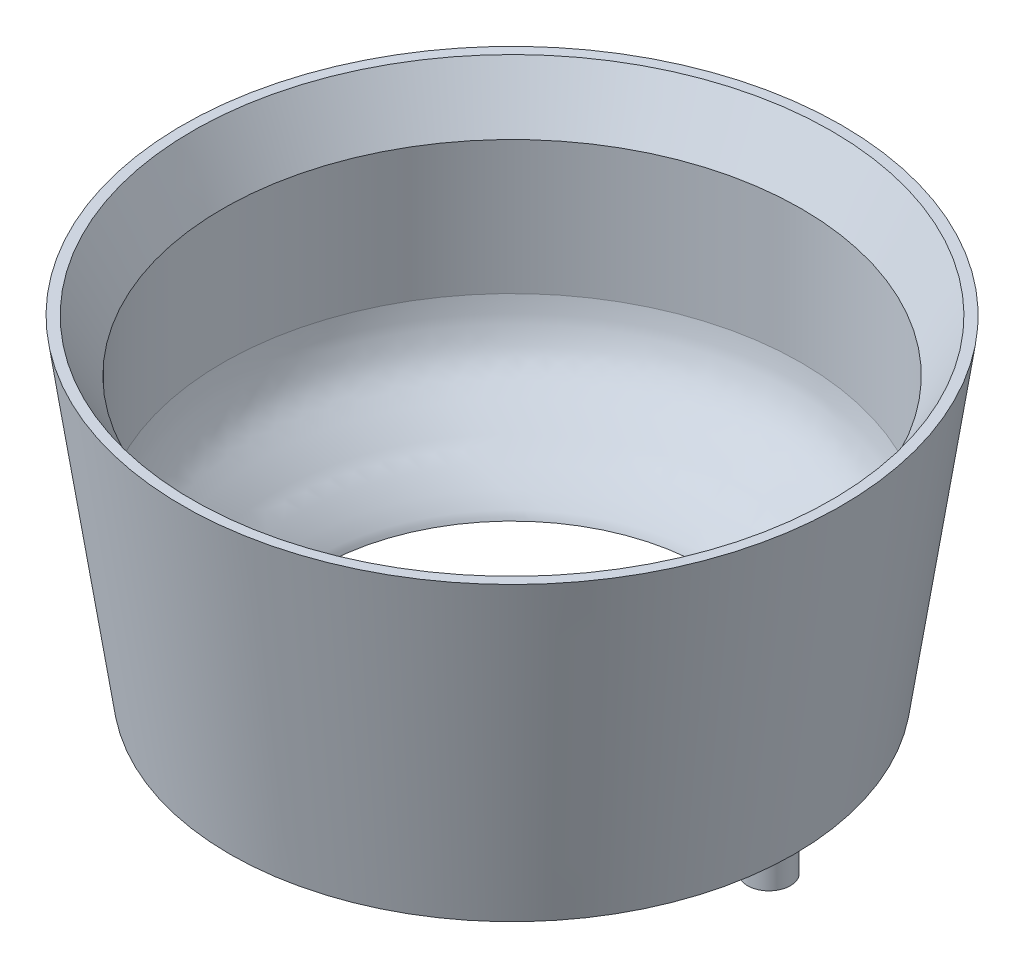
ISO-10303-21;
HEADER;
FILE_DESCRIPTION(('STEP AP214'),'2;1');
FILE_NAME('part.step','',(''),(''),'','','');
FILE_SCHEMA(('AUTOMOTIVE_DESIGN { 1 0 10303 214 1 1 1 1 }'));
ENDSEC;
DATA;
#1=APPLICATION_CONTEXT('core data for automotive mechanical design processes');
#2=APPLICATION_PROTOCOL_DEFINITION('international standard','automotive_design',2000,#1);
#3=PRODUCT_CONTEXT('',#1,'mechanical');
#4=PRODUCT('Part','Part','',(#3));
#5=PRODUCT_RELATED_PRODUCT_CATEGORY('part','',(#4));
#6=PRODUCT_DEFINITION_FORMATION('','',#4);
#7=PRODUCT_DEFINITION_CONTEXT('part definition',#1,'design');
#8=PRODUCT_DEFINITION('design','',#6,#7);
#9=PRODUCT_DEFINITION_SHAPE('','',#8);
#10=(LENGTH_UNIT() NAMED_UNIT(*) SI_UNIT(.MILLI.,.METRE.));
#11=(NAMED_UNIT(*) PLANE_ANGLE_UNIT() SI_UNIT($,.RADIAN.));
#12=(NAMED_UNIT(*) SI_UNIT($,.STERADIAN.) SOLID_ANGLE_UNIT());
#13=UNCERTAINTY_MEASURE_WITH_UNIT(LENGTH_MEASURE(1.E-05),#10,'distance_accuracy_value','');
#14=(GEOMETRIC_REPRESENTATION_CONTEXT(3) GLOBAL_UNCERTAINTY_ASSIGNED_CONTEXT((#13)) GLOBAL_UNIT_ASSIGNED_CONTEXT((#10,
#11,#12)) REPRESENTATION_CONTEXT('',''));
#15=CARTESIAN_POINT('',(0.,0.,0.));
#16=DIRECTION('',(0.,0.,1.));
#17=DIRECTION('',(1.,0.,0.));
#18=AXIS2_PLACEMENT_3D('',#15,#16,#17);
#19=CARTESIAN_POINT('',(0.,295.540718437762,-40.5476747547934));
#20=CARTESIAN_POINT('',(0.,295.012709615636,-40.4477404657415));
#21=CARTESIAN_POINT('',(0.,293.970757618623,-40.2927773525862));
#22=CARTESIAN_POINT('',(0.,292.587532752845,-39.930889754875));
#23=CARTESIAN_POINT('',(0.,291.581451359409,-39.51618641559));
#24=CARTESIAN_POINT('',(0.,290.578047280025,-39.1083707824325));
#25=CARTESIAN_POINT('',(0.,289.316986818185,-38.4396980542591));
#26=CARTESIAN_POINT('',(0.,288.032583078736,-37.3314160861705));
#27=CARTESIAN_POINT('',(0.,287.115418473763,-36.3683638812662));
#28=CARTESIAN_POINT('',(0.,286.340079672536,-35.6302312643945));
#29=CARTESIAN_POINT('',(0.,285.762737125999,-35.0164727262729));
#30=CARTESIAN_POINT('',(0.,285.247169223289,-34.3942597952709));
#31=CARTESIAN_POINT('',(0.,284.556557999368,-33.6355246615368));
#32=CARTESIAN_POINT('',(0.,283.771384037677,-32.9203613336381));
#33=CARTESIAN_POINT('',(0.,282.986073935963,-32.12965190107));
#34=CARTESIAN_POINT('',(0.,282.459482322822,-31.4852417836461));
#35=CARTESIAN_POINT('',(0.,281.963476572773,-30.9149972084707));
#36=CARTESIAN_POINT('',(0.,281.391298158875,-30.3717003462487));
#37=CARTESIAN_POINT('',(0.,280.804626849955,-29.7827961587849));
#38=CARTESIAN_POINT('',(0.,280.262154528045,-29.2275845813112));
#39=CARTESIAN_POINT('',(0.,279.674853681479,-28.7247526180959));
#40=CARTESIAN_POINT('',(0.,279.039651715273,-28.1803862534295));
#41=CARTESIAN_POINT('',(0.,278.470209991792,-27.651838315325));
#42=CARTESIAN_POINT('',(0.,277.876839186641,-27.3081459354535));
#43=CARTESIAN_POINT('',(0.,277.127164256162,-26.9952300805427));
#44=CARTESIAN_POINT('',(0.,276.164510632259,-26.5979526177344));
#45=CARTESIAN_POINT('',(0.,275.470548140668,-26.4648115829165));
#46=CARTESIAN_POINT('',(0.,274.996982716808,-26.5077562004189));
#47=B_SPLINE_CURVE_WITH_KNOTS('',3,(#19,#20,#21,#22,#23,#24,#25,#26,#27,#28,#29,#30,#31,#32,#33,
#34,#35,#36,#37,#38,#39,#40,#41,#42,#43,#44,#45,#46),.UNSPECIFIED.,.F.,.F.,(4,1,1,1,1,1,1,1,1,1,
1,1,1,1,1,1,1,1,1,1,1,1,1,1,1,4),(0.,0.0625440482121128,0.125088096424226,0.156360120530282,
0.187632144636338,0.250176192848451,0.312720241060564,0.375264289272677,0.406536313378733,
0.43780833748479,0.469080361590846,0.500352385696902,0.562896433909015,0.594168458015071,
0.625440482121128,0.656712506227184,0.687984530333241,0.719256554439297,0.750528578545353,
0.78180060265141,0.813072626757466,0.844344650863523,0.875616674969579,0.906888699075636,
0.938160723181692,1.0007047713938),.UNSPECIFIED.);
#48=CARTESIAN_POINT('',(0.,5.,0.));
#49=DIRECTION('',(0.,-1.,0.));
#50=AXIS1_PLACEMENT('',#48,#49);
#51=SURFACE_OF_REVOLUTION('',#47,#50);
#52=CARTESIAN_POINT('',(0.,277.427423014677,8.72575696706631E-13));
#53=DIRECTION('',(0.,-1.,0.));
#54=DIRECTION('',(0.,0.,-1.));
#55=AXIS2_PLACEMENT_3D('',#52,#53,#54);
#56=CIRCLE('',#55,27.1217156432865);
#57=CARTESIAN_POINT('',(0.,277.427423014677,-27.1217156432856));
#58=VERTEX_POINT('',#57);
#59=EDGE_CURVE('E64',#58,#58,#56,.F.);
#60=ORIENTED_EDGE('',*,*,#59,.F.);
#61=EDGE_LOOP('',(#60));
#62=FACE_BOUND('',#61,.T.);
#63=CARTESIAN_POINT('',(0.,295.540718437762,9.30591960996588E-13));
#64=DIRECTION('',(0.,-1.,0.));
#65=DIRECTION('',(0.,0.,-1.));
#66=AXIS2_PLACEMENT_3D('',#63,#64,#65);
#67=CIRCLE('',#66,40.5476747547944);
#68=CARTESIAN_POINT('',(0.,295.540718437762,-40.5476747547934));
#69=VERTEX_POINT('',#68);
#70=EDGE_CURVE('E53',#69,#69,#67,.T.);
#71=ORIENTED_EDGE('',*,*,#70,.F.);
#72=EDGE_LOOP('',(#71));
#73=FACE_BOUND('',#72,.T.);
#74=ADVANCED_FACE('F33',(#62,#73),#51,.F.);
#75=CARTESIAN_POINT('',(0.,5.,0.));
#76=DIRECTION('',(0.,-1.,0.));
#77=DIRECTION('',(0.,0.,-1.));
#78=AXIS2_PLACEMENT_3D('',#75,#76,#77);
#79=CYLINDRICAL_SURFACE('',#78,40.5476747547944);
#80=ORIENTED_EDGE('',*,*,#70,.T.);
#81=EDGE_LOOP('',(#80));
#82=FACE_BOUND('',#81,.T.);
#83=CARTESIAN_POINT('',(0.,314.238618936809,9.90480695303734E-13));
#84=DIRECTION('',(0.,-1.,0.));
#85=DIRECTION('',(0.,0.,-1.));
#86=AXIS2_PLACEMENT_3D('',#83,#84,#85);
#87=CIRCLE('',#86,40.5476747547944);
#88=CARTESIAN_POINT('',(0.,314.238618936809,-40.5476747547934));
#89=VERTEX_POINT('',#88);
#90=EDGE_CURVE('E68',#89,#89,#87,.T.);
#91=ORIENTED_EDGE('',*,*,#90,.F.);
#92=EDGE_LOOP('',(#91));
#93=FACE_BOUND('',#92,.T.);
#94=ADVANCED_FACE('F88',(#82,#93),#79,.F.);
#95=CARTESIAN_POINT('',(0.,321.561079724369,1.01393428618166E-12));
#96=DIRECTION('',(0.,1.,0.));
#97=DIRECTION('',(0.,0.,1.));
#98=AXIS2_PLACEMENT_3D('',#95,#96,#97);
#99=CONICAL_SURFACE('',#98,44.775299461623,0.523598775598309);
#100=ORIENTED_EDGE('',*,*,#90,.T.);
#101=EDGE_LOOP('',(#100));
#102=FACE_BOUND('',#101,.T.);
#103=CARTESIAN_POINT('',(0.,321.561079724369,1.01393428618166E-12));
#104=DIRECTION('',(0.,-1.,0.));
#105=DIRECTION('',(0.,0.,-1.));
#106=AXIS2_PLACEMENT_3D('',#103,#104,#105);
#107=CIRCLE('',#106,44.775299461623);
#108=CARTESIAN_POINT('',(0.,321.561079724369,-44.775299461622));
#109=VERTEX_POINT('',#108);
#110=EDGE_CURVE('E71',#109,#109,#107,.T.);
#111=ORIENTED_EDGE('',*,*,#110,.F.);
#112=EDGE_LOOP('',(#111));
#113=FACE_BOUND('',#112,.T.);
#114=ADVANCED_FACE('F172',(#102,#113),#99,.F.);
#115=CARTESIAN_POINT('',(0.,321.561079724369,-44.775299461622));
#116=DIRECTION('',(0.,1.,0.));
#117=DIRECTION('',(0.,0.,1.));
#118=AXIS2_PLACEMENT_3D('',#115,#116,#117);
#119=PLANE('',#118);
#120=ORIENTED_EDGE('',*,*,#110,.T.);
#121=EDGE_LOOP('',(#120));
#122=FACE_BOUND('',#121,.T.);
#123=CARTESIAN_POINT('',(0.,321.561079724369,1.01393428618166E-12));
#124=DIRECTION('',(0.,-1.,0.));
#125=DIRECTION('',(0.,0.,-1.));
#126=AXIS2_PLACEMENT_3D('',#123,#124,#125);
#127=CIRCLE('',#126,46.181267187361);
#128=CARTESIAN_POINT('',(0.,321.561079724369,-46.1812671873599));
#129=VERTEX_POINT('',#128);
#130=EDGE_CURVE('E74',#129,#129,#127,.T.);
#131=ORIENTED_EDGE('',*,*,#130,.F.);
#132=EDGE_LOOP('',(#131));
#133=FACE_BOUND('',#132,.T.);
#134=ADVANCED_FACE('F167',(#122,#133),#119,.T.);
#135=CARTESIAN_POINT('',(0.,273.84861893681,8.61112909931847E-13));
#136=DIRECTION('',(0.,1.,0.));
#137=DIRECTION('',(0.,0.,1.));
#138=AXIS2_PLACEMENT_3D('',#135,#136,#137);
#139=CONICAL_SURFACE('',#138,39.2207719119618,0.144862327915536);
#140=CARTESIAN_POINT('',(0.,275.933582581689,8.83805805603505E-13));
#141=DIRECTION('',(0.,-1.,0.));
#142=DIRECTION('',(0.,0.,-1.));
#143=AXIS2_PLACEMENT_3D('',#140,#141,#142);
#144=CIRCLE('',#143,39.5249352135398);
#145=CARTESIAN_POINT('',(0.,275.933582581689,-39.5249352135389));
#146=VERTEX_POINT('',#145);
#147=EDGE_CURVE('E61',#146,#146,#144,.T.);
#148=ORIENTED_EDGE('',*,*,#147,.F.);
#149=EDGE_LOOP('',(#148));
#150=FACE_BOUND('',#149,.T.);
#151=ORIENTED_EDGE('',*,*,#130,.T.);
#152=EDGE_LOOP('',(#151));
#153=FACE_BOUND('',#152,.T.);
#154=ADVANCED_FACE('F158',(#150,#153),#139,.T.);
#155=CARTESIAN_POINT('',(0.,0.,0.));
#156=DIRECTION('',(0.,-1.,0.));
#157=DIRECTION('',(0.,0.,-1.));
#158=AXIS2_PLACEMENT_3D('',#155,#156,#157);
#159=SPHERICAL_SURFACE('',#158,278.75);
#160=CARTESIAN_POINT('',(33.8783525231116,276.675478749677,-2.12099460802446));
#161=CARTESIAN_POINT('',(33.9982000626467,276.659884337187,-2.24086843661276));
#162=CARTESIAN_POINT('',(34.1282385831842,276.642963851548,-2.35056638395473));
#163=CARTESIAN_POINT('',(34.4048707417559,276.606963629717,-2.54643976068113));
#164=CARTESIAN_POINT('',(34.5514857894748,276.587881101033,-2.63258426713561));
#165=CARTESIAN_POINT('',(34.8568514788853,276.548132401469,-2.77881890790334));
#166=CARTESIAN_POINT('',(35.0155925541083,276.52746747894,-2.83892933633409));
#167=CARTESIAN_POINT('',(35.340751664115,276.485133130278,-2.93154687189749));
#168=CARTESIAN_POINT('',(35.5071677374518,276.463463960787,-2.9640609908664));
#169=CARTESIAN_POINT('',(35.843855802701,276.419618263828,-3.00073826725535));
#170=CARTESIAN_POINT('',(36.0141424848555,276.397439798172,-3.00476438699906));
#171=CARTESIAN_POINT('',(36.352987708314,276.353302627602,-2.98399303182203));
#172=CARTESIAN_POINT('',(36.521546142209,276.33134393635,-2.95919377625375));
#173=CARTESIAN_POINT('',(36.852477365454,276.288227391791,-2.88135923746257));
#174=CARTESIAN_POINT('',(37.0148374247663,276.267071187126,-2.82826887690922));
#175=CARTESIAN_POINT('',(37.3283696314927,276.226212196423,-2.6952608542964));
#176=CARTESIAN_POINT('',(37.4795419254605,276.206509391347,-2.61534354373126));
#177=CARTESIAN_POINT('',(37.7658204908552,276.169194104065,-2.43120211972922));
#178=CARTESIAN_POINT('',(37.9009804303889,276.1515746396,-2.32706288160083));
#179=CARTESIAN_POINT('',(38.1518820012827,276.118864375461,-2.09722306193674));
#180=CARTESIAN_POINT('',(38.2676243967691,276.103773476282,-1.97152332925146));
#181=CARTESIAN_POINT('',(38.4754794381209,276.076670805999,-1.70311509919473));
#182=CARTESIAN_POINT('',(38.5677603794068,276.06463710526,-1.56053915487038));
#183=CARTESIAN_POINT('',(38.727051823508,276.043864045402,-1.26168757879067));
#184=CARTESIAN_POINT('',(38.7940634803495,276.03512453584,-1.10541257306136));
#185=CARTESIAN_POINT('',(38.9003658459001,276.021260425893,-0.784951539522214));
#186=CARTESIAN_POINT('',(38.9398751818633,276.016107315807,-0.620839250503313));
#187=CARTESIAN_POINT('',(38.9908554164353,276.009458028676,-0.288245217837891));
#188=CARTESIAN_POINT('',(39.002327302886,276.007961722792,-0.119763628346033));
#189=CARTESIAN_POINT('',(38.9969030267168,276.008669215568,0.215868653380402));
#190=CARTESIAN_POINT('',(38.980151607798,276.010854135001,0.383021745948283));
#191=CARTESIAN_POINT('',(38.9190579627207,276.018822442168,0.712115890657347));
#192=CARTESIAN_POINT('',(38.8747159507294,276.024605801971,0.874056983245523));
#193=CARTESIAN_POINT('',(38.759753706787,276.039599131946,1.18816310168935));
#194=CARTESIAN_POINT('',(38.6891320065148,276.048809293584,1.34032758074055));
#195=CARTESIAN_POINT('',(38.5236839647315,276.070384812349,1.63062338654461));
#196=CARTESIAN_POINT('',(38.4288571113073,276.082750236206,1.76875441641861));
#197=CARTESIAN_POINT('',(38.2171959196434,276.110348564877,2.02784827165269));
#198=CARTESIAN_POINT('',(38.100250537441,276.125595937981,2.14871882226989));
#199=CARTESIAN_POINT('',(37.8480382790885,276.158476266224,2.36913635707703));
#200=CARTESIAN_POINT('',(37.7127706583888,276.176109318308,2.46868247429467));
#201=CARTESIAN_POINT('',(37.4265976647086,276.213409917428,2.64447391887805));
#202=CARTESIAN_POINT('',(37.2755758504073,276.233092611442,2.72052647556908));
#203=CARTESIAN_POINT('',(36.9630791253976,276.273815656248,2.84619822568946));
#204=CARTESIAN_POINT('',(36.8016037672241,276.294856065156,2.89581628674754));
#205=CARTESIAN_POINT('',(36.4715049898657,276.337863142638,2.96756120479271));
#206=CARTESIAN_POINT('',(36.3028376309129,276.359835498695,2.98948258244737));
#207=CARTESIAN_POINT('',(35.9642402450008,276.403939350839,3.00457025418317));
#208=CARTESIAN_POINT('',(35.7943101835327,276.426070851275,2.99773575947467));
#209=CARTESIAN_POINT('',(35.4573772309524,276.469947412848,2.9554170713028));
#210=CARTESIAN_POINT('',(35.2903868683354,276.491690823805,2.91983128870056));
#211=CARTESIAN_POINT('',(34.964716426679,276.534090786382,2.82084249483342));
#212=CARTESIAN_POINT('',(34.8060363258139,276.554747340857,2.75743955663058));
#213=CARTESIAN_POINT('',(34.5018331807529,276.594343584053,2.60469001169786));
#214=CARTESIAN_POINT('',(34.3562862865056,276.613286385141,2.51539172726022));
#215=CARTESIAN_POINT('',(34.0822500589489,276.648948695386,2.31327026520978));
#216=CARTESIAN_POINT('',(33.9537602362635,276.665668268328,2.20044776275773));
#217=CARTESIAN_POINT('',(33.7183946780627,276.696292560512,1.9552420860133));
#218=CARTESIAN_POINT('',(33.6113845583579,276.710214781509,1.82299010756748));
#219=CARTESIAN_POINT('',(33.4211178405538,276.734967377122,1.54212022992851));
#220=CARTESIAN_POINT('',(33.3378601979585,276.745797887693,1.3935030507803));
#221=CARTESIAN_POINT('',(33.1981768697685,276.763967755376,1.08543038550277));
#222=CARTESIAN_POINT('',(33.1415369205139,276.771334990867,0.926073683035057));
#223=CARTESIAN_POINT('',(33.0557842732633,276.782488722934,0.600005827499255));
#224=CARTESIAN_POINT('',(33.0266693643016,276.786275507114,0.433295266260532));
#225=CARTESIAN_POINT('',(32.99693469974,276.790142898487,0.0983933139503355));
#226=CARTESIAN_POINT('',(32.9961331928256,276.790247144878,-0.0697816973821867));
#227=CARTESIAN_POINT('',(33.0225951212478,276.786805416714,-0.403915482375722));
#228=CARTESIAN_POINT('',(33.049865146335,276.783258585074,-0.569873726387732));
#229=CARTESIAN_POINT('',(33.1316037724168,276.772627008864,-0.894604358933474));
#230=CARTESIAN_POINT('',(33.1860404767346,276.765546413321,-1.05338493696627));
#231=CARTESIAN_POINT('',(33.3204573333717,276.74806165397,-1.35937982576997));
#232=CARTESIAN_POINT('',(33.4004067098304,276.737661494538,-1.50660780716728));
#233=CARTESIAN_POINT('',(33.5480294788216,276.718457052042,-1.73157262108094));
#234=CARTESIAN_POINT('',(33.6085253073994,276.710586857611,-1.81419312198678));
#235=CARTESIAN_POINT('',(33.7375638560292,276.693797982724,-1.97277320017975));
#236=CARTESIAN_POINT('',(33.8061065563431,276.684879304841,-2.04873279380449));
#237=CARTESIAN_POINT('',(33.8783525231116,276.675478749677,-2.12099460802446));
#238=B_SPLINE_CURVE_WITH_KNOTS('',3,(#160,#161,#162,#163,#164,#165,#166,#167,#168,#169,#170,
#171,#172,#173,#174,#175,#176,#177,#178,#179,#180,#181,#182,#183,#184,#185,#186,#187,#188,#189,
#190,#191,#192,#193,#194,#195,#196,#197,#198,#199,#200,#201,#202,#203,#204,#205,#206,#207,#208,
#209,#210,#211,#212,#213,#214,#215,#216,#217,#218,#219,#220,#221,#222,#223,#224,#225,#226,#227,
#228,#229,#230,#231,#232,#233,#234,#235,#236,#237),.UNSPECIFIED.,.T.,.F.,(4,2,2,2,2,2,2,2,2,2,2,
2,2,2,2,2,2,2,2,2,2,2,2,2,2,2,2,2,2,2,2,2,2,2,2,2,2,2,4),(0.,0.510295295682274,1.02125736744355,
1.53182041335687,2.0422536934722,2.55514068499387,3.06805936108141,3.58198025873216,
4.09589442310804,4.60803422695568,5.12015387215886,5.62848912827261,6.1368011663446,
6.64102480028603,7.14523066869224,7.64685857224125,8.14848258203841,8.65013462320795,
9.15179727466164,9.65604874784134,10.1603207181248,10.6686267305622,11.1769545154921,
11.6890318112105,12.2011231535869,12.7150318623231,13.2289392212807,13.7418937018685,
14.2548334623464,14.7644565658309,15.2740572555951,15.7794824242064,16.2848669907787,
16.787006764836,17.289264442348,17.7909337964831,18.2920002615721,18.5996149822841,
18.9072289484699),.UNSPECIFIED.);
#239=CARTESIAN_POINT('',(33.8783525231116,276.675478749677,-2.12099460802446));
#240=VERTEX_POINT('',#239);
#241=EDGE_CURVE('E116',#240,#240,#238,.T.);
#242=ORIENTED_EDGE('',*,*,#241,.F.);
#243=EDGE_LOOP('',(#242));
#244=FACE_BOUND('',#243,.T.);
#245=CARTESIAN_POINT('',(-33.2645629251863,276.304090467417,15.8455338934833));
#246=CARTESIAN_POINT('',(-33.1425299911668,276.325562787258,15.7272960880299));
#247=CARTESIAN_POINT('',(-33.0103792627233,276.347500471454,15.6194006533605));
#248=CARTESIAN_POINT('',(-32.7296442957689,276.391671614735,15.4274501435381));
#249=CARTESIAN_POINT('',(-32.5810396891656,276.413905409749,15.3434250863673));
#250=CARTESIAN_POINT('',(-32.2717649706115,276.458011078519,15.2017494322027));
#251=CARTESIAN_POINT('',(-32.1111004665729,276.47988311479,15.1440866639841));
#252=CARTESIAN_POINT('',(-31.78225164439,276.522645631014,15.0567867798994));
#253=CARTESIAN_POINT('',(-31.6140693303755,276.543536369557,15.0271422409298));
#254=CARTESIAN_POINT('',(-31.2751042456533,276.583723347805,14.9967882899519));
#255=CARTESIAN_POINT('',(-31.1043244445602,276.603021266867,14.9960480042218));
#256=CARTESIAN_POINT('',(-30.764874791063,276.639489346397,15.0235561960697));
#257=CARTESIAN_POINT('',(-30.5962049707892,276.6566594745,15.0518051145439));
#258=CARTESIAN_POINT('',(-30.266889686526,276.688269018537,15.1363352864152));
#259=CARTESIAN_POINT('',(-30.1062012053706,276.702724598794,15.1924428487971));
#260=CARTESIAN_POINT('',(-29.7964078195632,276.72860846324,15.3311057199521));
#261=CARTESIAN_POINT('',(-29.6473023580412,276.740036893028,15.4136597562946));
#262=CARTESIAN_POINT('',(-29.3662078203387,276.759444502723,15.6021380405627));
#263=CARTESIAN_POINT('',(-29.234088382872,276.767451205319,15.7078650465803));
#264=CARTESIAN_POINT('',(-28.9893914197448,276.779911498783,15.9400992332991));
#265=CARTESIAN_POINT('',(-28.8768130442894,276.78436524419,16.0666055098925));
#266=CARTESIAN_POINT('',(-28.6751507337489,276.789568592018,16.3358827220705));
#267=CARTESIAN_POINT('',(-28.5859160487001,276.790342545607,16.4785403188815));
#268=CARTESIAN_POINT('',(-28.4325187373376,276.788229488351,16.7767251205027));
#269=CARTESIAN_POINT('',(-28.3683556458816,276.78534254543,16.9322520864882));
#270=CARTESIAN_POINT('',(-28.2670089562992,276.776003868586,17.2513877549006));
#271=CARTESIAN_POINT('',(-28.2297678601802,276.769559784001,17.4149784319085));
#272=CARTESIAN_POINT('',(-28.1830267677074,276.753302065479,17.7459091035264));
#273=CARTESIAN_POINT('',(-28.1735270349418,276.743488399527,17.9132491337461));
#274=CARTESIAN_POINT('',(-28.1824560481787,276.720740441366,18.2475108773753));
#275=CARTESIAN_POINT('',(-28.2009754139955,276.707796137872,18.4144294770611));
#276=CARTESIAN_POINT('',(-28.2654759623299,276.679177768266,18.7426288028133));
#277=CARTESIAN_POINT('',(-28.3114580900794,276.66350360821,18.9039093346225));
#278=CARTESIAN_POINT('',(-28.4299177375378,276.62975006191,19.2174982175175));
#279=CARTESIAN_POINT('',(-28.5025834041667,276.611654190513,19.3697337113687));
#280=CARTESIAN_POINT('',(-28.6722255718103,276.573659141942,19.6597465807494));
#281=CARTESIAN_POINT('',(-28.7692031443764,276.553759885306,19.797523318627));
#282=CARTESIAN_POINT('',(-28.9855673593796,276.512550152876,20.0558728556421));
#283=CARTESIAN_POINT('',(-29.1051279038419,276.4912296171,20.1762984272442));
#284=CARTESIAN_POINT('',(-29.3627345998317,276.447923146945,20.3952728372462));
#285=CARTESIAN_POINT('',(-29.5007814089076,276.425937188919,20.4938208971409));
#286=CARTESIAN_POINT('',(-29.7922678643829,276.381796682932,20.6667631630774));
#287=CARTESIAN_POINT('',(-29.9457868699413,276.359641867008,20.7410235869262));
#288=CARTESIAN_POINT('',(-30.2632464161633,276.315910655328,20.8625334115145));
#289=CARTESIAN_POINT('',(-30.4271870710628,276.294334265917,20.9097825161152));
#290=CARTESIAN_POINT('',(-30.7609187743238,276.252366482699,20.975885616054));
#291=CARTESIAN_POINT('',(-30.9307121993438,276.231975579537,20.9947279338175));
#292=CARTESIAN_POINT('',(-31.2712426972634,276.192977051692,21.0033496110958));
#293=CARTESIAN_POINT('',(-31.441979752029,276.174369392865,20.9931295271879));
#294=CARTESIAN_POINT('',(-31.7786623779666,276.139566453702,20.9439266286831));
#295=CARTESIAN_POINT('',(-31.9446271004682,276.123359961662,20.9050828990929));
#296=CARTESIAN_POINT('',(-32.267819323385,276.09373099431,20.7997870855339));
#297=CARTESIAN_POINT('',(-32.4250472013628,276.080308398623,20.7333361956617));
#298=CARTESIAN_POINT('',(-32.7249642318461,276.056743926711,20.5752762423729));
#299=CARTESIAN_POINT('',(-32.8677591136033,276.046576795813,20.4838715683134));
#300=CARTESIAN_POINT('',(-33.1360617701857,276.029683467155,20.2782245854507));
#301=CARTESIAN_POINT('',(-33.2615703015503,276.022957118773,20.1639832766328));
#302=CARTESIAN_POINT('',(-33.4907551571664,276.013186215811,19.9168537871119));
#303=CARTESIAN_POINT('',(-33.5945890316993,276.010114270195,19.7841127709551));
#304=CARTESIAN_POINT('',(-33.7786146331243,276.007652667834,19.5031168683984));
#305=CARTESIAN_POINT('',(-33.8588069698018,276.008262916105,19.3548623822707));
#306=CARTESIAN_POINT('',(-33.9930085191451,276.013137845833,19.0476666499398));
#307=CARTESIAN_POINT('',(-34.0471149813703,276.017388787328,18.8887676518102));
#308=CARTESIAN_POINT('',(-34.1281018147608,276.029399559065,18.564313547221));
#309=CARTESIAN_POINT('',(-34.1549832519708,276.037159251898,18.3987587016471));
#310=CARTESIAN_POINT('',(-34.1808637538504,276.055972124761,18.0654196214873));
#311=CARTESIAN_POINT('',(-34.1798203533116,276.067030295525,17.8976323793767));
#312=CARTESIAN_POINT('',(-34.1498736822734,276.092115870199,17.5647451290217));
#313=CARTESIAN_POINT('',(-34.1209627163118,276.106144093436,17.3996458758556));
#314=CARTESIAN_POINT('',(-34.0359173144874,276.136864852132,17.075689896972));
#315=CARTESIAN_POINT('',(-33.9796003361295,276.153574741882,16.9168828626421));
#316=CARTESIAN_POINT('',(-33.8413854525175,276.189098920582,16.6112357606252));
#317=CARTESIAN_POINT('',(-33.7595170498883,276.207910766533,16.4643821364006));
#318=CARTESIAN_POINT('',(-33.6077529004622,276.239742707466,16.2387533230312));
#319=CARTESIAN_POINT('',(-33.5448786411946,276.252289547411,16.155098726205));
#320=CARTESIAN_POINT('',(-33.4107988396142,276.277862439927,15.9948374786412));
#321=CARTESIAN_POINT('',(-33.3395932686771,276.290888494146,15.9182308521203));
#322=CARTESIAN_POINT('',(-33.2645629251863,276.304090467417,15.8455338934833));
#323=B_SPLINE_CURVE_WITH_KNOTS('',3,(#245,#246,#247,#248,#249,#250,#251,#252,#253,#254,#255,
#256,#257,#258,#259,#260,#261,#262,#263,#264,#265,#266,#267,#268,#269,#270,#271,#272,#273,#274,
#275,#276,#277,#278,#279,#280,#281,#282,#283,#284,#285,#286,#287,#288,#289,#290,#291,#292,#293,
#294,#295,#296,#297,#298,#299,#300,#301,#302,#303,#304,#305,#306,#307,#308,#309,#310,#311,#312,
#313,#314,#315,#316,#317,#318,#319,#320,#321,#322),.UNSPECIFIED.,.T.,.F.,(4,2,2,2,2,2,2,2,2,2,2,
2,2,2,2,2,2,2,2,2,2,2,2,2,2,2,2,2,2,2,2,2,2,2,2,2,2,2,4),(0.,0.513424174537841,1.02749117159408,
1.54132058839852,2.055013833894,2.56815836925487,3.08131070913697,3.59130311711187,
4.10127099128906,4.60705598951563,5.1128189868223,5.61523037489184,6.11763244150088,
6.61895831945041,7.12028896079624,7.62324448332496,8.12621731791435,8.63280695840297,
9.13941893084407,9.65010410943862,10.1608074577109,10.6742782778642,11.1877547273515,
11.7014422012732,12.2151198375749,12.7263177885689,13.2374936309414,13.7446020762138,
14.2516883207577,14.754949334433,15.2581973663754,15.759554469588,16.2608919405048,
16.7629918369127,17.2652304249484,17.770861020047,18.2759099417331,18.5915809540282,
18.9072530509221),.UNSPECIFIED.);
#324=CARTESIAN_POINT('',(-33.2645629251863,276.304090467417,15.8455338934833));
#325=VERTEX_POINT('',#324);
#326=EDGE_CURVE('E65',#325,#325,#323,.T.);
#327=ORIENTED_EDGE('',*,*,#326,.F.);
#328=EDGE_LOOP('',(#327));
#329=FACE_BOUND('',#328,.T.);
#330=ORIENTED_EDGE('',*,*,#59,.T.);
#331=EDGE_LOOP('',(#330));
#332=FACE_BOUND('',#331,.T.);
#333=ORIENTED_EDGE('',*,*,#147,.T.);
#334=EDGE_LOOP('',(#333));
#335=FACE_BOUND('',#334,.T.);
#336=ADVANCED_FACE('F142',(#244,#329,#332,#335),#159,.F.);
#337=CARTESIAN_POINT('',(-31.1769145362399,321.563079724369,18.0000000000008));
#338=DIRECTION('',(0.,-1.,0.));
#339=DIRECTION('',(0.,0.,-1.));
#340=AXIS2_PLACEMENT_3D('',#337,#338,#339);
#341=CYLINDRICAL_SURFACE('',#340,3.);
#342=ORIENTED_EDGE('',*,*,#326,.T.);
#343=EDGE_LOOP('',(#342));
#344=FACE_BOUND('',#343,.T.);
#345=CARTESIAN_POINT('',(-31.1769145362399,271.84861893681,18.0000000000007));
#346=DIRECTION('',(0.,-1.,0.));
#347=DIRECTION('',(0.,0.,-1.));
#348=AXIS2_PLACEMENT_3D('',#345,#346,#347);
#349=CIRCLE('',#348,3.);
#350=CARTESIAN_POINT('',(-31.1769145362399,271.84861893681,15.0000000000007));
#351=VERTEX_POINT('',#350);
#352=EDGE_CURVE('E120',#351,#351,#349,.T.);
#353=ORIENTED_EDGE('',*,*,#352,.F.);
#354=EDGE_LOOP('',(#353));
#355=FACE_BOUND('',#354,.T.);
#356=ADVANCED_FACE('F137',(#344,#355),#341,.T.);
#357=CARTESIAN_POINT('',(-31.1769145362399,271.84861893681,18.0000000000007));
#358=DIRECTION('',(0.,-1.,0.));
#359=DIRECTION('',(0.,0.,-1.));
#360=AXIS2_PLACEMENT_3D('',#357,#358,#359);
#361=PLANE('',#360);
#362=CARTESIAN_POINT('',(-31.1769145362399,271.84861893681,18.0000000000007));
#363=DIRECTION('',(0.,-1.,0.));
#364=DIRECTION('',(0.,0.,-1.));
#365=AXIS2_PLACEMENT_3D('',#362,#363,#364);
#366=CIRCLE('',#365,2.55);
#367=CARTESIAN_POINT('',(-31.1769145362399,271.84861893681,15.4500000000007));
#368=VERTEX_POINT('',#367);
#369=EDGE_CURVE('E44',#368,#368,#366,.F.);
#370=ORIENTED_EDGE('',*,*,#369,.T.);
#371=EDGE_LOOP('',(#370));
#372=FACE_BOUND('',#371,.T.);
#373=ORIENTED_EDGE('',*,*,#352,.T.);
#374=EDGE_LOOP('',(#373));
#375=FACE_BOUND('',#374,.T.);
#376=ADVANCED_FACE('F134',(#372,#375),#361,.T.);
#377=CARTESIAN_POINT('',(36.,321.563079724369,1.0299555207058E-12));
#378=DIRECTION('',(0.,-1.,0.));
#379=DIRECTION('',(0.,0.,-1.));
#380=AXIS2_PLACEMENT_3D('',#377,#378,#379);
#381=CYLINDRICAL_SURFACE('',#380,3.);
#382=ORIENTED_EDGE('',*,*,#241,.T.);
#383=EDGE_LOOP('',(#382));
#384=FACE_BOUND('',#383,.T.);
#385=CARTESIAN_POINT('',(36.,271.84861893681,8.70721807087471E-13));
#386=DIRECTION('',(0.,-1.,0.));
#387=DIRECTION('',(0.,0.,-1.));
#388=AXIS2_PLACEMENT_3D('',#385,#386,#387);
#389=CIRCLE('',#388,3.);
#390=CARTESIAN_POINT('',(36.,271.84861893681,-2.99999999999913));
#391=VERTEX_POINT('',#390);
#392=EDGE_CURVE('E114',#391,#391,#389,.T.);
#393=ORIENTED_EDGE('',*,*,#392,.F.);
#394=EDGE_LOOP('',(#393));
#395=FACE_BOUND('',#394,.T.);
#396=ADVANCED_FACE('F110',(#384,#395),#381,.T.);
#397=CARTESIAN_POINT('',(36.,271.84861893681,8.70721807087471E-13));
#398=DIRECTION('',(0.,-1.,0.));
#399=DIRECTION('',(0.,0.,-1.));
#400=AXIS2_PLACEMENT_3D('',#397,#398,#399);
#401=PLANE('',#400);
#402=CARTESIAN_POINT('',(36.,271.84861893681,8.70721807087471E-13));
#403=DIRECTION('',(0.,-1.,0.));
#404=DIRECTION('',(0.,0.,-1.));
#405=AXIS2_PLACEMENT_3D('',#402,#403,#404);
#406=CIRCLE('',#405,2.55000000000001);
#407=CARTESIAN_POINT('',(36.,271.84861893681,-2.54999999999914));
#408=VERTEX_POINT('',#407);
#409=EDGE_CURVE('E48',#408,#408,#406,.F.);
#410=ORIENTED_EDGE('',*,*,#409,.T.);
#411=EDGE_LOOP('',(#410));
#412=FACE_BOUND('',#411,.T.);
#413=ORIENTED_EDGE('',*,*,#392,.T.);
#414=EDGE_LOOP('',(#413));
#415=FACE_BOUND('',#414,.T.);
#416=ADVANCED_FACE('F106',(#412,#415),#401,.T.);
#417=CARTESIAN_POINT('',(-31.1769145362399,272.34861893681,18.0000000000007));
#418=DIRECTION('',(0.,-1.,0.));
#419=DIRECTION('',(0.,0.,-1.));
#420=AXIS2_PLACEMENT_3D('',#417,#418,#419);
#421=PLANE('',#420);
#422=CARTESIAN_POINT('',(-31.1769145362399,272.34861893681,18.0000000000007));
#423=DIRECTION('',(0.,-1.,0.));
#424=DIRECTION('',(0.,0.,-1.));
#425=AXIS2_PLACEMENT_3D('',#422,#423,#424);
#426=CIRCLE('',#425,2.05);
#427=CARTESIAN_POINT('',(-31.1769145362399,272.34861893681,15.9500000000007));
#428=VERTEX_POINT('',#427);
#429=EDGE_CURVE('E10',#428,#428,#426,.T.);
#430=ORIENTED_EDGE('',*,*,#429,.T.);
#431=EDGE_LOOP('',(#430));
#432=FACE_BOUND('',#431,.T.);
#433=CARTESIAN_POINT('',(-31.1769145362399,272.34861893681,18.0000000000007));
#434=DIRECTION('',(0.,-1.,0.));
#435=DIRECTION('',(0.,0.,-1.));
#436=AXIS2_PLACEMENT_3D('',#433,#434,#435);
#437=CIRCLE('',#436,1.5);
#438=CARTESIAN_POINT('',(-31.1769145362399,272.34861893681,16.5000000000007));
#439=VERTEX_POINT('',#438);
#440=EDGE_CURVE('E58',#439,#439,#437,.F.);
#441=ORIENTED_EDGE('',*,*,#440,.T.);
#442=EDGE_LOOP('',(#441));
#443=FACE_BOUND('',#442,.T.);
#444=ADVANCED_FACE('F109',(#432,#443),#421,.T.);
#445=CARTESIAN_POINT('',(36.,272.34861893681,8.72323289946742E-13));
#446=DIRECTION('',(0.,-1.,0.));
#447=DIRECTION('',(0.,0.,-1.));
#448=AXIS2_PLACEMENT_3D('',#445,#446,#447);
#449=PLANE('',#448);
#450=CARTESIAN_POINT('',(36.,272.34861893681,8.72323289946742E-13));
#451=DIRECTION('',(0.,-1.,0.));
#452=DIRECTION('',(0.,0.,-1.));
#453=AXIS2_PLACEMENT_3D('',#450,#451,#452);
#454=CIRCLE('',#453,2.05);
#455=CARTESIAN_POINT('',(36.,272.34861893681,-2.04999999999913));
#456=VERTEX_POINT('',#455);
#457=EDGE_CURVE('E40',#456,#456,#454,.T.);
#458=ORIENTED_EDGE('',*,*,#457,.T.);
#459=EDGE_LOOP('',(#458));
#460=FACE_BOUND('',#459,.T.);
#461=CARTESIAN_POINT('',(36.,272.34861893681,8.72323289946742E-13));
#462=DIRECTION('',(0.,-1.,0.));
#463=DIRECTION('',(0.,0.,-1.));
#464=AXIS2_PLACEMENT_3D('',#461,#462,#463);
#465=CIRCLE('',#464,1.5);
#466=CARTESIAN_POINT('',(36.,272.34861893681,-1.49999999999913));
#467=VERTEX_POINT('',#466);
#468=EDGE_CURVE('E54',#467,#467,#465,.F.);
#469=ORIENTED_EDGE('',*,*,#468,.T.);
#470=EDGE_LOOP('',(#469));
#471=FACE_BOUND('',#470,.T.);
#472=ADVANCED_FACE('F246',(#460,#471),#449,.T.);
#473=CARTESIAN_POINT('',(-31.1769145362399,277.84861893681,18.0000000000007));
#474=DIRECTION('',(0.,-1.,0.));
#475=DIRECTION('',(0.,0.,-1.));
#476=AXIS2_PLACEMENT_3D('',#473,#474,#475);
#477=PLANE('',#476);
#478=CARTESIAN_POINT('',(-31.1769145362399,277.84861893681,18.0000000000007));
#479=DIRECTION('',(0.,-1.,0.));
#480=DIRECTION('',(0.,0.,-1.));
#481=AXIS2_PLACEMENT_3D('',#478,#479,#480);
#482=CIRCLE('',#481,1.5);
#483=CARTESIAN_POINT('',(-31.1769145362399,277.84861893681,16.5000000000007));
#484=VERTEX_POINT('',#483);
#485=EDGE_CURVE('E117',#484,#484,#482,.T.);
#486=ORIENTED_EDGE('',*,*,#485,.T.);
#487=EDGE_LOOP('',(#486));
#488=FACE_BOUND('',#487,.T.);
#489=ADVANCED_FACE('F242',(#488),#477,.T.);
#490=CARTESIAN_POINT('',(-31.1769145362399,277.84861893681,18.0000000000007));
#491=DIRECTION('',(0.,-1.,0.));
#492=DIRECTION('',(0.,0.,-1.));
#493=AXIS2_PLACEMENT_3D('',#490,#491,#492);
#494=CYLINDRICAL_SURFACE('',#493,1.5);
#495=ORIENTED_EDGE('',*,*,#485,.F.);
#496=EDGE_LOOP('',(#495));
#497=FACE_BOUND('',#496,.T.);
#498=ORIENTED_EDGE('',*,*,#440,.F.);
#499=EDGE_LOOP('',(#498));
#500=FACE_BOUND('',#499,.T.);
#501=ADVANCED_FACE('F234',(#497,#500),#494,.F.);
#502=CARTESIAN_POINT('',(36.,277.84861893681,8.89939601398721E-13));
#503=DIRECTION('',(0.,-1.,0.));
#504=DIRECTION('',(0.,0.,-1.));
#505=AXIS2_PLACEMENT_3D('',#502,#503,#504);
#506=PLANE('',#505);
#507=CARTESIAN_POINT('',(36.,277.84861893681,8.89939601398721E-13));
#508=DIRECTION('',(0.,-1.,0.));
#509=DIRECTION('',(0.,0.,-1.));
#510=AXIS2_PLACEMENT_3D('',#507,#508,#509);
#511=CIRCLE('',#510,1.5);
#512=CARTESIAN_POINT('',(36.,277.84861893681,-1.49999999999911));
#513=VERTEX_POINT('',#512);
#514=EDGE_CURVE('E57',#513,#513,#511,.T.);
#515=ORIENTED_EDGE('',*,*,#514,.T.);
#516=EDGE_LOOP('',(#515));
#517=FACE_BOUND('',#516,.T.);
#518=ADVANCED_FACE('F100',(#517),#506,.T.);
#519=CARTESIAN_POINT('',(36.,277.84861893681,8.89939601398721E-13));
#520=DIRECTION('',(0.,-1.,0.));
#521=DIRECTION('',(0.,0.,-1.));
#522=AXIS2_PLACEMENT_3D('',#519,#520,#521);
#523=CYLINDRICAL_SURFACE('',#522,1.5);
#524=ORIENTED_EDGE('',*,*,#514,.F.);
#525=EDGE_LOOP('',(#524));
#526=FACE_BOUND('',#525,.T.);
#527=ORIENTED_EDGE('',*,*,#468,.F.);
#528=EDGE_LOOP('',(#527));
#529=FACE_BOUND('',#528,.T.);
#530=ADVANCED_FACE('F93',(#526,#529),#523,.F.);
#531=CARTESIAN_POINT('',(36.,272.39861893681,8.72483438232669E-13));
#532=DIRECTION('',(0.,-1.,0.));
#533=DIRECTION('',(0.,0.,-1.));
#534=AXIS2_PLACEMENT_3D('',#531,#532,#533);
#535=CONICAL_SURFACE('',#534,2.,0.785398163397457);
#536=ORIENTED_EDGE('',*,*,#409,.F.);
#537=EDGE_LOOP('',(#536));
#538=FACE_BOUND('',#537,.T.);
#539=ORIENTED_EDGE('',*,*,#457,.F.);
#540=EDGE_LOOP('',(#539));
#541=FACE_BOUND('',#540,.T.);
#542=ADVANCED_FACE('F91',(#538,#541),#535,.F.);
#543=CARTESIAN_POINT('',(-31.1769145362399,272.39861893681,18.0000000000007));
#544=DIRECTION('',(0.,-1.,0.));
#545=DIRECTION('',(0.,0.,-1.));
#546=AXIS2_PLACEMENT_3D('',#543,#544,#545);
#547=CONICAL_SURFACE('',#546,2.,0.785398163397455);
#548=ORIENTED_EDGE('',*,*,#369,.F.);
#549=EDGE_LOOP('',(#548));
#550=FACE_BOUND('',#549,.T.);
#551=ORIENTED_EDGE('',*,*,#429,.F.);
#552=EDGE_LOOP('',(#551));
#553=FACE_BOUND('',#552,.T.);
#554=ADVANCED_FACE('F35',(#550,#553),#547,.F.);
#555=CLOSED_SHELL('',(#74,#94,#114,#134,#154,#336,#356,#376,#396,#416,#444,#472,#489,#501,#518,
#530,#542,#554));
#556=MANIFOLD_SOLID_BREP('B2',#555);
#557=ADVANCED_BREP_SHAPE_REPRESENTATION('',(#18,#556),#14);
#558=SHAPE_DEFINITION_REPRESENTATION(#9,#557);
ENDSEC;
END-ISO-10303-21;
